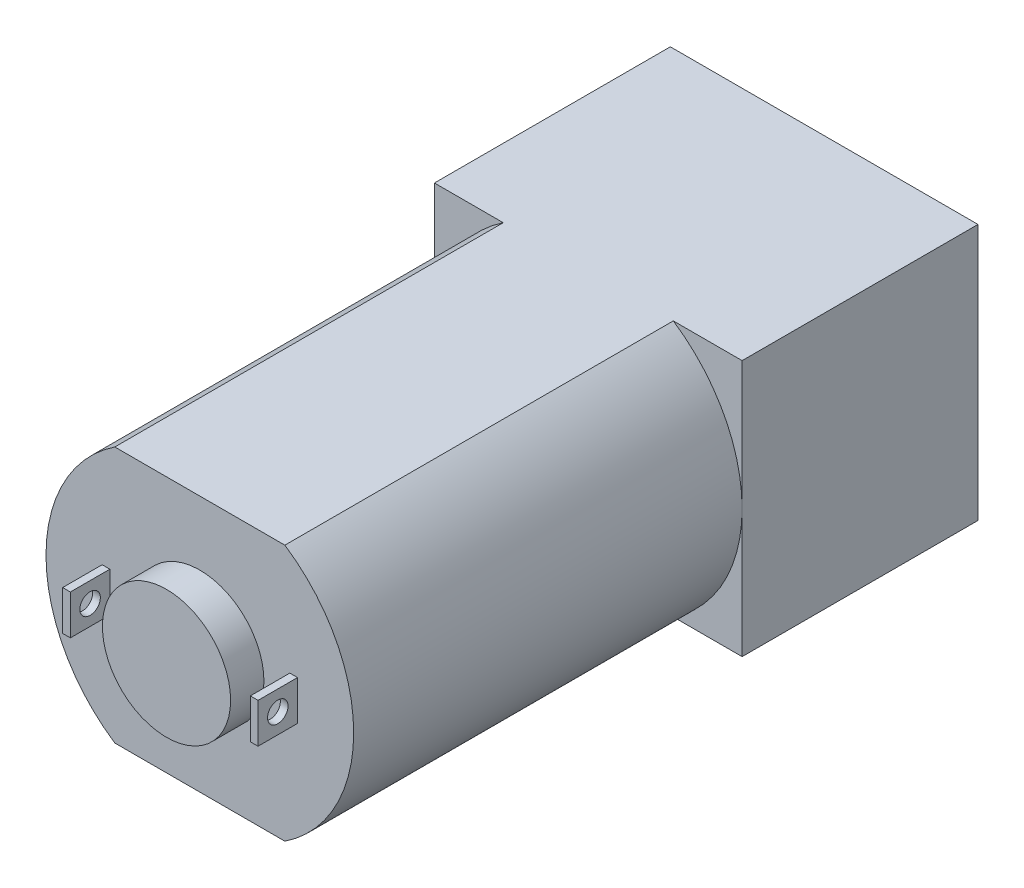
ISO-10303-21;
HEADER;
FILE_DESCRIPTION(('STEP AP214'),'2;1');
FILE_NAME('part.step','',(''),(''),'','','');
FILE_SCHEMA(('AUTOMOTIVE_DESIGN { 1 0 10303 214 1 1 1 1 }'));
ENDSEC;
DATA;
#1=APPLICATION_CONTEXT('core data for automotive mechanical design processes');
#2=APPLICATION_PROTOCOL_DEFINITION('international standard','automotive_design',2000,#1);
#3=PRODUCT_CONTEXT('',#1,'mechanical');
#4=PRODUCT('Part','Part','',(#3));
#5=PRODUCT_RELATED_PRODUCT_CATEGORY('part','',(#4));
#6=PRODUCT_DEFINITION_FORMATION('','',#4);
#7=PRODUCT_DEFINITION_CONTEXT('part definition',#1,'design');
#8=PRODUCT_DEFINITION('design','',#6,#7);
#9=PRODUCT_DEFINITION_SHAPE('','',#8);
#10=(LENGTH_UNIT() NAMED_UNIT(*) SI_UNIT(.MILLI.,.METRE.));
#11=(NAMED_UNIT(*) PLANE_ANGLE_UNIT() SI_UNIT($,.RADIAN.));
#12=(NAMED_UNIT(*) SI_UNIT($,.STERADIAN.) SOLID_ANGLE_UNIT());
#13=UNCERTAINTY_MEASURE_WITH_UNIT(LENGTH_MEASURE(1.E-05),#10,'distance_accuracy_value','');
#14=(GEOMETRIC_REPRESENTATION_CONTEXT(3) GLOBAL_UNCERTAINTY_ASSIGNED_CONTEXT((#13)) GLOBAL_UNIT_ASSIGNED_CONTEXT((#10,
#11,#12)) REPRESENTATION_CONTEXT('',''));
#15=CARTESIAN_POINT('',(0.,0.,0.));
#16=DIRECTION('',(0.,0.,1.));
#17=DIRECTION('',(1.,0.,0.));
#18=AXIS2_PLACEMENT_3D('',#15,#16,#17);
#19=CARTESIAN_POINT('',(3.81,0.775000000000002,16.69));
#20=DIRECTION('',(0.,-1.,0.));
#21=DIRECTION('',(1.,0.,0.));
#22=AXIS2_PLACEMENT_3D('',#19,#20,#21);
#23=PLANE('',#22);
#24=DIRECTION('',(-1.,0.,0.));
#25=VECTOR('',#24,1.);
#26=CARTESIAN_POINT('',(3.81,0.775000000000002,15.15));
#27=LINE('',#26,#25);
#28=CARTESIAN_POINT('',(3.81,0.775000000000002,15.15));
#29=VERTEX_POINT('',#28);
#30=CARTESIAN_POINT('',(3.51,0.775000000000002,15.15));
#31=VERTEX_POINT('',#30);
#32=EDGE_CURVE('E108',#29,#31,#27,.T.);
#33=ORIENTED_EDGE('',*,*,#32,.T.);
#34=DIRECTION('',(0.,0.,-1.));
#35=VECTOR('',#34,1.);
#36=CARTESIAN_POINT('',(3.51,0.775000000000002,16.69));
#37=LINE('',#36,#35);
#38=CARTESIAN_POINT('',(3.51,0.775000000000002,16.69));
#39=VERTEX_POINT('',#38);
#40=EDGE_CURVE('E12',#39,#31,#37,.T.);
#41=ORIENTED_EDGE('',*,*,#40,.F.);
#42=DIRECTION('',(-1.,0.,0.));
#43=VECTOR('',#42,1.);
#44=CARTESIAN_POINT('',(3.81,0.775000000000002,16.69));
#45=LINE('',#44,#43);
#46=CARTESIAN_POINT('',(3.81,0.775000000000002,16.69));
#47=VERTEX_POINT('',#46);
#48=EDGE_CURVE('E96',#47,#39,#45,.T.);
#49=ORIENTED_EDGE('',*,*,#48,.F.);
#50=DIRECTION('',(0.,0.,-1.));
#51=VECTOR('',#50,1.);
#52=CARTESIAN_POINT('',(3.81,0.775000000000002,16.69));
#53=LINE('',#52,#51);
#54=EDGE_CURVE('E104',#47,#29,#53,.T.);
#55=ORIENTED_EDGE('',*,*,#54,.T.);
#56=EDGE_LOOP('',(#33,#41,#49,#55));
#57=FACE_BOUND('',#56,.T.);
#58=ADVANCED_FACE('F45',(#57),#23,.F.);
#59=CARTESIAN_POINT('',(3.51,0.775000000000002,16.69));
#60=DIRECTION('',(1.,0.,0.));
#61=DIRECTION('',(0.,1.,0.));
#62=AXIS2_PLACEMENT_3D('',#59,#60,#61);
#63=PLANE('',#62);
#64=CARTESIAN_POINT('',(3.51,0.,15.92));
#65=DIRECTION('',(-1.,0.,0.));
#66=DIRECTION('',(0.,-1.,0.));
#67=AXIS2_PLACEMENT_3D('',#64,#65,#66);
#68=CIRCLE('',#67,0.400000000000001);
#69=CARTESIAN_POINT('',(3.51,-0.4,15.92));
#70=VERTEX_POINT('',#69);
#71=EDGE_CURVE('E124',#70,#70,#68,.T.);
#72=ORIENTED_EDGE('',*,*,#71,.F.);
#73=EDGE_LOOP('',(#72));
#74=FACE_BOUND('',#73,.T.);
#75=DIRECTION('',(0.,-1.,0.));
#76=VECTOR('',#75,1.);
#77=CARTESIAN_POINT('',(3.51,0.775000000000002,15.15));
#78=LINE('',#77,#76);
#79=CARTESIAN_POINT('',(3.51,-0.775,15.15));
#80=VERTEX_POINT('',#79);
#81=EDGE_CURVE('E100',#31,#80,#78,.T.);
#82=ORIENTED_EDGE('',*,*,#81,.T.);
#83=DIRECTION('',(0.,0.,-1.));
#84=VECTOR('',#83,1.);
#85=CARTESIAN_POINT('',(3.51,-0.775,16.69));
#86=LINE('',#85,#84);
#87=CARTESIAN_POINT('',(3.51,-0.775,16.69));
#88=VERTEX_POINT('',#87);
#89=EDGE_CURVE('E53',#88,#80,#86,.T.);
#90=ORIENTED_EDGE('',*,*,#89,.F.);
#91=DIRECTION('',(0.,-1.,0.));
#92=VECTOR('',#91,1.);
#93=CARTESIAN_POINT('',(3.51,0.775000000000002,16.69));
#94=LINE('',#93,#92);
#95=EDGE_CURVE('E91',#39,#88,#94,.T.);
#96=ORIENTED_EDGE('',*,*,#95,.F.);
#97=ORIENTED_EDGE('',*,*,#40,.T.);
#98=EDGE_LOOP('',(#82,#90,#96,#97));
#99=FACE_BOUND('',#98,.T.);
#100=ADVANCED_FACE('F99',(#74,#99),#63,.F.);
#101=CARTESIAN_POINT('',(3.81,-0.775000000000001,16.69));
#102=DIRECTION('',(0.,1.,0.));
#103=DIRECTION('',(-1.,0.,0.));
#104=AXIS2_PLACEMENT_3D('',#101,#102,#103);
#105=PLANE('',#104);
#106=DIRECTION('',(1.,0.,0.));
#107=VECTOR('',#106,1.);
#108=CARTESIAN_POINT('',(3.81,-0.775000000000001,15.15));
#109=LINE('',#108,#107);
#110=CARTESIAN_POINT('',(3.81,-0.775000000000001,15.15));
#111=VERTEX_POINT('',#110);
#112=EDGE_CURVE('E78',#80,#111,#109,.T.);
#113=ORIENTED_EDGE('',*,*,#112,.T.);
#114=DIRECTION('',(0.,0.,-1.));
#115=VECTOR('',#114,1.);
#116=CARTESIAN_POINT('',(3.81,-0.775000000000001,16.69));
#117=LINE('',#116,#115);
#118=CARTESIAN_POINT('',(3.81,-0.775000000000001,16.69));
#119=VERTEX_POINT('',#118);
#120=EDGE_CURVE('E101',#119,#111,#117,.T.);
#121=ORIENTED_EDGE('',*,*,#120,.F.);
#122=DIRECTION('',(1.,0.,0.));
#123=VECTOR('',#122,1.);
#124=CARTESIAN_POINT('',(3.81,-0.775000000000001,16.69));
#125=LINE('',#124,#123);
#126=EDGE_CURVE('E94',#88,#119,#125,.T.);
#127=ORIENTED_EDGE('',*,*,#126,.F.);
#128=ORIENTED_EDGE('',*,*,#89,.T.);
#129=EDGE_LOOP('',(#113,#121,#127,#128));
#130=FACE_BOUND('',#129,.T.);
#131=ADVANCED_FACE('F102',(#130),#105,.F.);
#132=CARTESIAN_POINT('',(3.81,0.775000000000002,16.69));
#133=DIRECTION('',(-1.,0.,0.));
#134=DIRECTION('',(0.,-1.,0.));
#135=AXIS2_PLACEMENT_3D('',#132,#133,#134);
#136=PLANE('',#135);
#137=CARTESIAN_POINT('',(3.81,0.,15.92));
#138=DIRECTION('',(-1.,0.,0.));
#139=DIRECTION('',(0.,-1.,0.));
#140=AXIS2_PLACEMENT_3D('',#137,#138,#139);
#141=CIRCLE('',#140,0.400000000000001);
#142=CARTESIAN_POINT('',(3.81,-0.4,15.92));
#143=VERTEX_POINT('',#142);
#144=EDGE_CURVE('E111',#143,#143,#141,.F.);
#145=ORIENTED_EDGE('',*,*,#144,.F.);
#146=EDGE_LOOP('',(#145));
#147=FACE_BOUND('',#146,.T.);
#148=DIRECTION('',(0.,1.,0.));
#149=VECTOR('',#148,1.);
#150=CARTESIAN_POINT('',(3.81,0.775000000000002,15.15));
#151=LINE('',#150,#149);
#152=EDGE_CURVE('E84',#111,#29,#151,.T.);
#153=ORIENTED_EDGE('',*,*,#152,.T.);
#154=ORIENTED_EDGE('',*,*,#54,.F.);
#155=DIRECTION('',(0.,1.,0.));
#156=VECTOR('',#155,1.);
#157=CARTESIAN_POINT('',(3.81,0.775000000000002,16.69));
#158=LINE('',#157,#156);
#159=EDGE_CURVE('E61',#119,#47,#158,.T.);
#160=ORIENTED_EDGE('',*,*,#159,.F.);
#161=ORIENTED_EDGE('',*,*,#120,.T.);
#162=EDGE_LOOP('',(#153,#154,#160,#161));
#163=FACE_BOUND('',#162,.T.);
#164=ADVANCED_FACE('F116',(#147,#163),#136,.F.);
#165=CARTESIAN_POINT('',(0.,0.,16.69));
#166=DIRECTION('',(0.,0.,1.));
#167=DIRECTION('',(1.,0.,0.));
#168=AXIS2_PLACEMENT_3D('',#165,#166,#167);
#169=PLANE('',#168);
#170=ORIENTED_EDGE('',*,*,#48,.T.);
#171=ORIENTED_EDGE('',*,*,#95,.T.);
#172=ORIENTED_EDGE('',*,*,#126,.T.);
#173=ORIENTED_EDGE('',*,*,#159,.T.);
#174=EDGE_LOOP('',(#170,#171,#172,#173));
#175=FACE_BOUND('',#174,.T.);
#176=ADVANCED_FACE('F92',(#175),#169,.T.);
#177=CARTESIAN_POINT('',(0.,0.,15.15));
#178=DIRECTION('',(0.,0.,1.));
#179=DIRECTION('',(1.,0.,0.));
#180=AXIS2_PLACEMENT_3D('',#177,#178,#179);
#181=PLANE('',#180);
#182=ORIENTED_EDGE('',*,*,#32,.F.);
#183=ORIENTED_EDGE('',*,*,#152,.F.);
#184=ORIENTED_EDGE('',*,*,#112,.F.);
#185=ORIENTED_EDGE('',*,*,#81,.F.);
#186=EDGE_LOOP('',(#182,#183,#184,#185));
#187=FACE_BOUND('',#186,.T.);
#188=ADVANCED_FACE('F119',(#187),#181,.F.);
#189=CARTESIAN_POINT('',(6.00102500000001,0.,15.92));
#190=DIRECTION('',(-1.,0.,0.));
#191=DIRECTION('',(0.,-1.,0.));
#192=AXIS2_PLACEMENT_3D('',#189,#190,#191);
#193=CYLINDRICAL_SURFACE('',#192,0.400000000000001);
#194=ORIENTED_EDGE('',*,*,#71,.T.);
#195=EDGE_LOOP('',(#194));
#196=FACE_BOUND('',#195,.T.);
#197=ORIENTED_EDGE('',*,*,#144,.T.);
#198=EDGE_LOOP('',(#197));
#199=FACE_BOUND('',#198,.T.);
#200=ADVANCED_FACE('F128',(#196,#199),#193,.F.);
#201=CLOSED_SHELL('',(#58,#100,#131,#164,#176,#188,#200));
#202=MANIFOLD_SOLID_BREP('B2',#201);
#203=CARTESIAN_POINT('',(-3.81,0.774999999999999,16.69));
#204=DIRECTION('',(1.,0.,0.));
#205=DIRECTION('',(0.,1.,0.));
#206=AXIS2_PLACEMENT_3D('',#203,#204,#205);
#207=PLANE('',#206);
#208=CARTESIAN_POINT('',(-3.81,0.,15.92));
#209=DIRECTION('',(-1.,0.,0.));
#210=DIRECTION('',(0.,-1.,0.));
#211=AXIS2_PLACEMENT_3D('',#208,#209,#210);
#212=CIRCLE('',#211,0.400000000000001);
#213=CARTESIAN_POINT('',(-3.81,-0.400000000000002,15.92));
#214=VERTEX_POINT('',#213);
#215=EDGE_CURVE('E287',#214,#214,#212,.T.);
#216=ORIENTED_EDGE('',*,*,#215,.F.);
#217=EDGE_LOOP('',(#216));
#218=FACE_BOUND('',#217,.T.);
#219=DIRECTION('',(0.,-1.,0.));
#220=VECTOR('',#219,1.);
#221=CARTESIAN_POINT('',(-3.81,0.774999999999999,15.15));
#222=LINE('',#221,#220);
#223=CARTESIAN_POINT('',(-3.81,0.774999999999999,15.15));
#224=VERTEX_POINT('',#223);
#225=CARTESIAN_POINT('',(-3.81,-0.775000000000001,15.15));
#226=VERTEX_POINT('',#225);
#227=EDGE_CURVE('E271',#224,#226,#222,.T.);
#228=ORIENTED_EDGE('',*,*,#227,.T.);
#229=DIRECTION('',(0.,0.,-1.));
#230=VECTOR('',#229,1.);
#231=CARTESIAN_POINT('',(-3.81,-0.775000000000001,16.69));
#232=LINE('',#231,#230);
#233=CARTESIAN_POINT('',(-3.81,-0.775000000000001,16.69));
#234=VERTEX_POINT('',#233);
#235=EDGE_CURVE('E43',#234,#226,#232,.T.);
#236=ORIENTED_EDGE('',*,*,#235,.F.);
#237=DIRECTION('',(0.,-1.,0.));
#238=VECTOR('',#237,1.);
#239=CARTESIAN_POINT('',(-3.81,0.774999999999999,16.69));
#240=LINE('',#239,#238);
#241=CARTESIAN_POINT('',(-3.81,0.774999999999999,16.69));
#242=VERTEX_POINT('',#241);
#243=EDGE_CURVE('E259',#242,#234,#240,.T.);
#244=ORIENTED_EDGE('',*,*,#243,.F.);
#245=DIRECTION('',(0.,0.,-1.));
#246=VECTOR('',#245,1.);
#247=CARTESIAN_POINT('',(-3.81,0.774999999999999,16.69));
#248=LINE('',#247,#246);
#249=EDGE_CURVE('E267',#242,#224,#248,.T.);
#250=ORIENTED_EDGE('',*,*,#249,.T.);
#251=EDGE_LOOP('',(#228,#236,#244,#250));
#252=FACE_BOUND('',#251,.T.);
#253=ADVANCED_FACE('F208',(#218,#252),#207,.F.);
#254=CARTESIAN_POINT('',(-3.81,-0.775000000000001,16.69));
#255=DIRECTION('',(0.,1.,0.));
#256=DIRECTION('',(-1.,0.,0.));
#257=AXIS2_PLACEMENT_3D('',#254,#255,#256);
#258=PLANE('',#257);
#259=DIRECTION('',(1.,0.,0.));
#260=VECTOR('',#259,1.);
#261=CARTESIAN_POINT('',(-3.81,-0.775000000000001,15.15));
#262=LINE('',#261,#260);
#263=CARTESIAN_POINT('',(-3.51,-0.775,15.15));
#264=VERTEX_POINT('',#263);
#265=EDGE_CURVE('E263',#226,#264,#262,.T.);
#266=ORIENTED_EDGE('',*,*,#265,.T.);
#267=DIRECTION('',(0.,0.,-1.));
#268=VECTOR('',#267,1.);
#269=CARTESIAN_POINT('',(-3.51,-0.775,16.69));
#270=LINE('',#269,#268);
#271=CARTESIAN_POINT('',(-3.51,-0.775,16.69));
#272=VERTEX_POINT('',#271);
#273=EDGE_CURVE('E216',#272,#264,#270,.T.);
#274=ORIENTED_EDGE('',*,*,#273,.F.);
#275=DIRECTION('',(1.,0.,0.));
#276=VECTOR('',#275,1.);
#277=CARTESIAN_POINT('',(-3.81,-0.775000000000001,16.69));
#278=LINE('',#277,#276);
#279=EDGE_CURVE('E254',#234,#272,#278,.T.);
#280=ORIENTED_EDGE('',*,*,#279,.F.);
#281=ORIENTED_EDGE('',*,*,#235,.T.);
#282=EDGE_LOOP('',(#266,#274,#280,#281));
#283=FACE_BOUND('',#282,.T.);
#284=ADVANCED_FACE('F262',(#283),#258,.F.);
#285=CARTESIAN_POINT('',(-3.51,0.774999999999999,16.69));
#286=DIRECTION('',(-1.,0.,0.));
#287=DIRECTION('',(0.,-1.,0.));
#288=AXIS2_PLACEMENT_3D('',#285,#286,#287);
#289=PLANE('',#288);
#290=CARTESIAN_POINT('',(-3.51,0.,15.92));
#291=DIRECTION('',(-1.,0.,0.));
#292=DIRECTION('',(0.,-1.,0.));
#293=AXIS2_PLACEMENT_3D('',#290,#291,#292);
#294=CIRCLE('',#293,0.400000000000001);
#295=CARTESIAN_POINT('',(-3.51,-0.400000000000002,15.92));
#296=VERTEX_POINT('',#295);
#297=EDGE_CURVE('E274',#296,#296,#294,.F.);
#298=ORIENTED_EDGE('',*,*,#297,.F.);
#299=EDGE_LOOP('',(#298));
#300=FACE_BOUND('',#299,.T.);
#301=DIRECTION('',(0.,1.,0.));
#302=VECTOR('',#301,1.);
#303=CARTESIAN_POINT('',(-3.51,0.774999999999999,15.15));
#304=LINE('',#303,#302);
#305=CARTESIAN_POINT('',(-3.51,0.774999999999999,15.15));
#306=VERTEX_POINT('',#305);
#307=EDGE_CURVE('E241',#264,#306,#304,.T.);
#308=ORIENTED_EDGE('',*,*,#307,.T.);
#309=DIRECTION('',(0.,0.,-1.));
#310=VECTOR('',#309,1.);
#311=CARTESIAN_POINT('',(-3.51,0.774999999999999,16.69));
#312=LINE('',#311,#310);
#313=CARTESIAN_POINT('',(-3.51,0.774999999999999,16.69));
#314=VERTEX_POINT('',#313);
#315=EDGE_CURVE('E264',#314,#306,#312,.T.);
#316=ORIENTED_EDGE('',*,*,#315,.F.);
#317=DIRECTION('',(0.,1.,0.));
#318=VECTOR('',#317,1.);
#319=CARTESIAN_POINT('',(-3.51,0.774999999999999,16.69));
#320=LINE('',#319,#318);
#321=EDGE_CURVE('E257',#272,#314,#320,.T.);
#322=ORIENTED_EDGE('',*,*,#321,.F.);
#323=ORIENTED_EDGE('',*,*,#273,.T.);
#324=EDGE_LOOP('',(#308,#316,#322,#323));
#325=FACE_BOUND('',#324,.T.);
#326=ADVANCED_FACE('F265',(#300,#325),#289,.F.);
#327=CARTESIAN_POINT('',(-3.81,0.774999999999999,16.69));
#328=DIRECTION('',(0.,-1.,0.));
#329=DIRECTION('',(1.,0.,0.));
#330=AXIS2_PLACEMENT_3D('',#327,#328,#329);
#331=PLANE('',#330);
#332=DIRECTION('',(-1.,0.,0.));
#333=VECTOR('',#332,1.);
#334=CARTESIAN_POINT('',(-3.81,0.774999999999999,15.15));
#335=LINE('',#334,#333);
#336=EDGE_CURVE('E247',#306,#224,#335,.T.);
#337=ORIENTED_EDGE('',*,*,#336,.T.);
#338=ORIENTED_EDGE('',*,*,#249,.F.);
#339=DIRECTION('',(-1.,0.,0.));
#340=VECTOR('',#339,1.);
#341=CARTESIAN_POINT('',(-3.81,0.774999999999999,16.69));
#342=LINE('',#341,#340);
#343=EDGE_CURVE('E224',#314,#242,#342,.T.);
#344=ORIENTED_EDGE('',*,*,#343,.F.);
#345=ORIENTED_EDGE('',*,*,#315,.T.);
#346=EDGE_LOOP('',(#337,#338,#344,#345));
#347=FACE_BOUND('',#346,.T.);
#348=ADVANCED_FACE('F279',(#347),#331,.F.);
#349=CARTESIAN_POINT('',(0.,0.,16.69));
#350=DIRECTION('',(0.,0.,1.));
#351=DIRECTION('',(1.,0.,0.));
#352=AXIS2_PLACEMENT_3D('',#349,#350,#351);
#353=PLANE('',#352);
#354=ORIENTED_EDGE('',*,*,#243,.T.);
#355=ORIENTED_EDGE('',*,*,#279,.T.);
#356=ORIENTED_EDGE('',*,*,#321,.T.);
#357=ORIENTED_EDGE('',*,*,#343,.T.);
#358=EDGE_LOOP('',(#354,#355,#356,#357));
#359=FACE_BOUND('',#358,.T.);
#360=ADVANCED_FACE('F255',(#359),#353,.T.);
#361=CARTESIAN_POINT('',(0.,0.,15.15));
#362=DIRECTION('',(0.,0.,1.));
#363=DIRECTION('',(1.,0.,0.));
#364=AXIS2_PLACEMENT_3D('',#361,#362,#363);
#365=PLANE('',#364);
#366=ORIENTED_EDGE('',*,*,#227,.F.);
#367=ORIENTED_EDGE('',*,*,#336,.F.);
#368=ORIENTED_EDGE('',*,*,#307,.F.);
#369=ORIENTED_EDGE('',*,*,#265,.F.);
#370=EDGE_LOOP('',(#366,#367,#368,#369));
#371=FACE_BOUND('',#370,.T.);
#372=ADVANCED_FACE('F282',(#371),#365,.F.);
#373=CARTESIAN_POINT('',(6.00102500000001,0.,15.92));
#374=DIRECTION('',(-1.,0.,0.));
#375=DIRECTION('',(0.,-1.,0.));
#376=AXIS2_PLACEMENT_3D('',#373,#374,#375);
#377=CYLINDRICAL_SURFACE('',#376,0.400000000000001);
#378=ORIENTED_EDGE('',*,*,#215,.T.);
#379=EDGE_LOOP('',(#378));
#380=FACE_BOUND('',#379,.T.);
#381=ORIENTED_EDGE('',*,*,#297,.T.);
#382=EDGE_LOOP('',(#381));
#383=FACE_BOUND('',#382,.T.);
#384=ADVANCED_FACE('F291',(#380,#383),#377,.F.);
#385=CLOSED_SHELL('',(#253,#284,#326,#348,#360,#372,#384));
#386=MANIFOLD_SOLID_BREP('B6',#385);
#387=CARTESIAN_POINT('',(0.,0.,-9.2));
#388=DIRECTION('',(0.,0.,-1.));
#389=DIRECTION('',(-1.,0.,0.));
#390=AXIS2_PLACEMENT_3D('',#387,#388,#389);
#391=PLANE('',#390);
#392=DIRECTION('',(0.,-1.,0.));
#393=VECTOR('',#392,1.);
#394=CARTESIAN_POINT('',(6.,5.,-9.2));
#395=LINE('',#394,#393);
#396=CARTESIAN_POINT('',(6.,5.,-9.2));
#397=VERTEX_POINT('',#396);
#398=CARTESIAN_POINT('',(6.,-4.99999999999999,-9.2));
#399=VERTEX_POINT('',#398);
#400=EDGE_CURVE('E443',#397,#399,#395,.T.);
#401=ORIENTED_EDGE('',*,*,#400,.T.);
#402=DIRECTION('',(-1.,0.,0.));
#403=VECTOR('',#402,1.);
#404=CARTESIAN_POINT('',(6.,-4.99999999999999,-9.2));
#405=LINE('',#404,#403);
#406=CARTESIAN_POINT('',(-6.,-4.99999999999999,-9.2));
#407=VERTEX_POINT('',#406);
#408=EDGE_CURVE('E431',#399,#407,#405,.T.);
#409=ORIENTED_EDGE('',*,*,#408,.T.);
#410=DIRECTION('',(0.,1.,0.));
#411=VECTOR('',#410,1.);
#412=CARTESIAN_POINT('',(-6.,5.,-9.2));
#413=LINE('',#412,#411);
#414=CARTESIAN_POINT('',(-6.,5.,-9.2));
#415=VERTEX_POINT('',#414);
#416=EDGE_CURVE('E442',#407,#415,#413,.T.);
#417=ORIENTED_EDGE('',*,*,#416,.T.);
#418=DIRECTION('',(1.,0.,0.));
#419=VECTOR('',#418,1.);
#420=CARTESIAN_POINT('',(6.,5.,-9.2));
#421=LINE('',#420,#419);
#422=EDGE_CURVE('E448',#415,#397,#421,.T.);
#423=ORIENTED_EDGE('',*,*,#422,.T.);
#424=EDGE_LOOP('',(#401,#409,#417,#423));
#425=FACE_BOUND('',#424,.T.);
#426=CARTESIAN_POINT('',(0.,0.,-9.2));
#427=DIRECTION('',(0.,0.,-1.));
#428=DIRECTION('',(-1.,0.,0.));
#429=AXIS2_PLACEMENT_3D('',#426,#427,#428);
#430=CIRCLE('',#429,2.);
#431=CARTESIAN_POINT('',(-2.,0.,-9.2));
#432=VERTEX_POINT('',#431);
#433=EDGE_CURVE('E546',#432,#432,#430,.T.);
#434=ORIENTED_EDGE('',*,*,#433,.F.);
#435=EDGE_LOOP('',(#434));
#436=FACE_BOUND('',#435,.T.);
#437=ADVANCED_FACE('F362',(#425,#436),#391,.T.);
#438=CARTESIAN_POINT('',(0.,0.,15.15));
#439=DIRECTION('',(0.,0.,1.));
#440=DIRECTION('',(1.,0.,0.));
#441=AXIS2_PLACEMENT_3D('',#438,#439,#440);
#442=PLANE('',#441);
#443=CARTESIAN_POINT('',(0.,0.,15.15));
#444=DIRECTION('',(0.,0.,1.));
#445=DIRECTION('',(1.,0.,0.));
#446=AXIS2_PLACEMENT_3D('',#443,#444,#445);
#447=CIRCLE('',#446,6.);
#448=CARTESIAN_POINT('',(3.31662479035541,-4.99999999999999,15.15));
#449=VERTEX_POINT('',#448);
#450=CARTESIAN_POINT('',(3.31662479035541,5.,15.15));
#451=VERTEX_POINT('',#450);
#452=EDGE_CURVE('E497',#449,#451,#447,.T.);
#453=ORIENTED_EDGE('',*,*,#452,.T.);
#454=DIRECTION('',(-1.,0.,0.));
#455=VECTOR('',#454,1.);
#456=CARTESIAN_POINT('',(3.31662479035541,5.,15.15));
#457=LINE('',#456,#455);
#458=CARTESIAN_POINT('',(-3.3166247903554,5.,15.15));
#459=VERTEX_POINT('',#458);
#460=EDGE_CURVE('E500',#451,#459,#457,.T.);
#461=ORIENTED_EDGE('',*,*,#460,.T.);
#462=CARTESIAN_POINT('',(0.,0.,15.15));
#463=DIRECTION('',(0.,0.,1.));
#464=DIRECTION('',(1.,0.,0.));
#465=AXIS2_PLACEMENT_3D('',#462,#463,#464);
#466=CIRCLE('',#465,6.);
#467=CARTESIAN_POINT('',(-3.31662479035541,-4.99999999999999,15.15));
#468=VERTEX_POINT('',#467);
#469=EDGE_CURVE('E521',#459,#468,#466,.T.);
#470=ORIENTED_EDGE('',*,*,#469,.T.);
#471=DIRECTION('',(1.,0.,0.));
#472=VECTOR('',#471,1.);
#473=CARTESIAN_POINT('',(3.31662479035541,-4.99999999999999,15.15));
#474=LINE('',#473,#472);
#475=EDGE_CURVE('E380',#468,#449,#474,.T.);
#476=ORIENTED_EDGE('',*,*,#475,.T.);
#477=EDGE_LOOP('',(#453,#461,#470,#476));
#478=FACE_BOUND('',#477,.T.);
#479=CARTESIAN_POINT('',(0.,0.,15.15));
#480=DIRECTION('',(0.,0.,1.));
#481=DIRECTION('',(1.,0.,0.));
#482=AXIS2_PLACEMENT_3D('',#479,#480,#481);
#483=CIRCLE('',#482,2.5);
#484=CARTESIAN_POINT('',(2.5,0.,15.15));
#485=VERTEX_POINT('',#484);
#486=EDGE_CURVE('E539',#485,#485,#483,.T.);
#487=ORIENTED_EDGE('',*,*,#486,.F.);
#488=EDGE_LOOP('',(#487));
#489=FACE_BOUND('',#488,.T.);
#490=ADVANCED_FACE('F561',(#478,#489),#442,.T.);
#491=CARTESIAN_POINT('',(0.,0.,15.15));
#492=DIRECTION('',(0.,0.,-1.));
#493=DIRECTION('',(-1.,0.,0.));
#494=AXIS2_PLACEMENT_3D('',#491,#492,#493);
#495=CYLINDRICAL_SURFACE('',#494,6.);
#496=CARTESIAN_POINT('',(0.,0.,0.));
#497=DIRECTION('',(0.,0.,1.));
#498=DIRECTION('',(1.,0.,0.));
#499=AXIS2_PLACEMENT_3D('',#496,#497,#498);
#500=CIRCLE('',#499,6.);
#501=CARTESIAN_POINT('',(3.31662479035541,-4.99999999999999,0.));
#502=VERTEX_POINT('',#501);
#503=CARTESIAN_POINT('',(6.,0.,0.));
#504=VERTEX_POINT('',#503);
#505=EDGE_CURVE('E462',#502,#504,#500,.T.);
#506=ORIENTED_EDGE('',*,*,#505,.T.);
#507=CARTESIAN_POINT('',(3.3166247903554,5.,0.));
#508=VERTEX_POINT('',#507);
#509=EDGE_CURVE('E459',#504,#508,#500,.T.);
#510=ORIENTED_EDGE('',*,*,#509,.T.);
#511=DIRECTION('',(0.,0.,-1.));
#512=VECTOR('',#511,1.);
#513=CARTESIAN_POINT('',(3.31662479035541,5.,15.15));
#514=LINE('',#513,#512);
#515=EDGE_CURVE('E206',#451,#508,#514,.T.);
#516=ORIENTED_EDGE('',*,*,#515,.F.);
#517=ORIENTED_EDGE('',*,*,#452,.F.);
#518=DIRECTION('',(0.,0.,-1.));
#519=VECTOR('',#518,1.);
#520=CARTESIAN_POINT('',(3.31662479035541,-4.99999999999999,15.15));
#521=LINE('',#520,#519);
#522=EDGE_CURVE('E515',#449,#502,#521,.T.);
#523=ORIENTED_EDGE('',*,*,#522,.T.);
#524=EDGE_LOOP('',(#506,#510,#516,#517,#523));
#525=FACE_BOUND('',#524,.T.);
#526=ADVANCED_FACE('F364',(#525),#495,.T.);
#527=CARTESIAN_POINT('',(3.31662479035541,5.,15.15));
#528=DIRECTION('',(0.,-1.,0.));
#529=DIRECTION('',(0.,0.,-1.));
#530=AXIS2_PLACEMENT_3D('',#527,#528,#529);
#531=PLANE('',#530);
#532=ORIENTED_EDGE('',*,*,#515,.T.);
#533=DIRECTION('',(1.,0.,0.));
#534=VECTOR('',#533,1.);
#535=CARTESIAN_POINT('',(6.,5.,0.));
#536=LINE('',#535,#534);
#537=CARTESIAN_POINT('',(6.,5.,0.));
#538=VERTEX_POINT('',#537);
#539=EDGE_CURVE('E471',#508,#538,#536,.T.);
#540=ORIENTED_EDGE('',*,*,#539,.T.);
#541=DIRECTION('',(0.,0.,1.));
#542=VECTOR('',#541,1.);
#543=CARTESIAN_POINT('',(6.,5.,-9.2));
#544=LINE('',#543,#542);
#545=EDGE_CURVE('E478',#397,#538,#544,.T.);
#546=ORIENTED_EDGE('',*,*,#545,.F.);
#547=ORIENTED_EDGE('',*,*,#422,.F.);
#548=DIRECTION('',(0.,0.,1.));
#549=VECTOR('',#548,1.);
#550=CARTESIAN_POINT('',(-6.,5.,-9.2));
#551=LINE('',#550,#549);
#552=CARTESIAN_POINT('',(-6.,5.,0.));
#553=VERTEX_POINT('',#552);
#554=EDGE_CURVE('E464',#415,#553,#551,.T.);
#555=ORIENTED_EDGE('',*,*,#554,.T.);
#556=CARTESIAN_POINT('',(-3.3166247903554,5.,0.));
#557=VERTEX_POINT('',#556);
#558=EDGE_CURVE('E452',#553,#557,#536,.T.);
#559=ORIENTED_EDGE('',*,*,#558,.T.);
#560=DIRECTION('',(0.,0.,-1.));
#561=VECTOR('',#560,1.);
#562=CARTESIAN_POINT('',(-3.3166247903554,5.,15.15));
#563=LINE('',#562,#561);
#564=EDGE_CURVE('E372',#459,#557,#563,.T.);
#565=ORIENTED_EDGE('',*,*,#564,.F.);
#566=ORIENTED_EDGE('',*,*,#460,.F.);
#567=EDGE_LOOP('',(#532,#540,#546,#547,#555,#559,#565,#566));
#568=FACE_BOUND('',#567,.T.);
#569=ADVANCED_FACE('F484',(#568),#531,.F.);
#570=CARTESIAN_POINT('',(0.,0.,15.15));
#571=DIRECTION('',(0.,0.,-1.));
#572=DIRECTION('',(-1.,0.,0.));
#573=AXIS2_PLACEMENT_3D('',#570,#571,#572);
#574=CYLINDRICAL_SURFACE('',#573,6.);
#575=CARTESIAN_POINT('',(0.,0.,0.));
#576=DIRECTION('',(0.,0.,1.));
#577=DIRECTION('',(1.,0.,0.));
#578=AXIS2_PLACEMENT_3D('',#575,#576,#577);
#579=CIRCLE('',#578,6.);
#580=CARTESIAN_POINT('',(-6.,0.,0.));
#581=VERTEX_POINT('',#580);
#582=EDGE_CURVE('E494',#557,#581,#579,.T.);
#583=ORIENTED_EDGE('',*,*,#582,.T.);
#584=CARTESIAN_POINT('',(-3.31662479035541,-4.99999999999999,0.));
#585=VERTEX_POINT('',#584);
#586=EDGE_CURVE('E498',#581,#585,#579,.T.);
#587=ORIENTED_EDGE('',*,*,#586,.T.);
#588=DIRECTION('',(0.,0.,-1.));
#589=VECTOR('',#588,1.);
#590=CARTESIAN_POINT('',(-3.31662479035541,-4.99999999999999,15.15));
#591=LINE('',#590,#589);
#592=EDGE_CURVE('E514',#468,#585,#591,.T.);
#593=ORIENTED_EDGE('',*,*,#592,.F.);
#594=ORIENTED_EDGE('',*,*,#469,.F.);
#595=ORIENTED_EDGE('',*,*,#564,.T.);
#596=EDGE_LOOP('',(#583,#587,#593,#594,#595));
#597=FACE_BOUND('',#596,.T.);
#598=ADVANCED_FACE('F582',(#597),#574,.T.);
#599=CARTESIAN_POINT('',(3.31662479035541,-4.99999999999999,15.15));
#600=DIRECTION('',(0.,1.,0.));
#601=DIRECTION('',(0.,0.,1.));
#602=AXIS2_PLACEMENT_3D('',#599,#600,#601);
#603=PLANE('',#602);
#604=ORIENTED_EDGE('',*,*,#592,.T.);
#605=DIRECTION('',(-1.,0.,0.));
#606=VECTOR('',#605,1.);
#607=CARTESIAN_POINT('',(6.,-4.99999999999999,0.));
#608=LINE('',#607,#606);
#609=CARTESIAN_POINT('',(-6.,-4.99999999999999,0.));
#610=VERTEX_POINT('',#609);
#611=EDGE_CURVE('E530',#585,#610,#608,.T.);
#612=ORIENTED_EDGE('',*,*,#611,.T.);
#613=DIRECTION('',(0.,0.,1.));
#614=VECTOR('',#613,1.);
#615=CARTESIAN_POINT('',(-6.,-4.99999999999999,-9.2));
#616=LINE('',#615,#614);
#617=EDGE_CURVE('E439',#407,#610,#616,.T.);
#618=ORIENTED_EDGE('',*,*,#617,.F.);
#619=ORIENTED_EDGE('',*,*,#408,.F.);
#620=DIRECTION('',(0.,0.,1.));
#621=VECTOR('',#620,1.);
#622=CARTESIAN_POINT('',(6.,-4.99999999999999,-9.2));
#623=LINE('',#622,#621);
#624=CARTESIAN_POINT('',(6.,-4.99999999999999,0.));
#625=VERTEX_POINT('',#624);
#626=EDGE_CURVE('E437',#399,#625,#623,.T.);
#627=ORIENTED_EDGE('',*,*,#626,.T.);
#628=EDGE_CURVE('E529',#625,#502,#608,.T.);
#629=ORIENTED_EDGE('',*,*,#628,.T.);
#630=ORIENTED_EDGE('',*,*,#522,.F.);
#631=ORIENTED_EDGE('',*,*,#475,.F.);
#632=EDGE_LOOP('',(#604,#612,#618,#619,#627,#629,#630,#631));
#633=FACE_BOUND('',#632,.T.);
#634=ADVANCED_FACE('F434',(#633),#603,.F.);
#635=CARTESIAN_POINT('',(0.,0.,0.));
#636=DIRECTION('',(0.,0.,-1.));
#637=DIRECTION('',(-1.,0.,0.));
#638=AXIS2_PLACEMENT_3D('',#635,#636,#637);
#639=PLANE('',#638);
#640=ORIENTED_EDGE('',*,*,#505,.F.);
#641=ORIENTED_EDGE('',*,*,#628,.F.);
#642=DIRECTION('',(0.,-1.,0.));
#643=VECTOR('',#642,1.);
#644=CARTESIAN_POINT('',(6.,5.,0.));
#645=LINE('',#644,#643);
#646=EDGE_CURVE('E457',#504,#625,#645,.T.);
#647=ORIENTED_EDGE('',*,*,#646,.F.);
#648=EDGE_LOOP('',(#640,#641,#647));
#649=FACE_BOUND('',#648,.T.);
#650=ADVANCED_FACE('F528',(#649),#639,.F.);
#651=ORIENTED_EDGE('',*,*,#509,.F.);
#652=EDGE_CURVE('E531',#538,#504,#645,.T.);
#653=ORIENTED_EDGE('',*,*,#652,.F.);
#654=ORIENTED_EDGE('',*,*,#539,.F.);
#655=EDGE_LOOP('',(#651,#653,#654));
#656=FACE_BOUND('',#655,.T.);
#657=ADVANCED_FACE('F652',(#656),#639,.F.);
#658=ORIENTED_EDGE('',*,*,#582,.F.);
#659=ORIENTED_EDGE('',*,*,#558,.F.);
#660=DIRECTION('',(0.,1.,0.));
#661=VECTOR('',#660,1.);
#662=CARTESIAN_POINT('',(-6.,5.,0.));
#663=LINE('',#662,#661);
#664=EDGE_CURVE('E491',#581,#553,#663,.T.);
#665=ORIENTED_EDGE('',*,*,#664,.F.);
#666=EDGE_LOOP('',(#658,#659,#665));
#667=FACE_BOUND('',#666,.T.);
#668=ADVANCED_FACE('F490',(#667),#639,.F.);
#669=CARTESIAN_POINT('',(6.,5.,-9.2));
#670=DIRECTION('',(-1.,0.,0.));
#671=DIRECTION('',(0.,-1.,0.));
#672=AXIS2_PLACEMENT_3D('',#669,#670,#671);
#673=PLANE('',#672);
#674=ORIENTED_EDGE('',*,*,#652,.T.);
#675=ORIENTED_EDGE('',*,*,#646,.T.);
#676=ORIENTED_EDGE('',*,*,#626,.F.);
#677=ORIENTED_EDGE('',*,*,#400,.F.);
#678=ORIENTED_EDGE('',*,*,#545,.T.);
#679=EDGE_LOOP('',(#674,#675,#676,#677,#678));
#680=FACE_BOUND('',#679,.T.);
#681=ADVANCED_FACE('F455',(#680),#673,.F.);
#682=CARTESIAN_POINT('',(-6.,5.,-9.2));
#683=DIRECTION('',(1.,0.,0.));
#684=DIRECTION('',(0.,1.,0.));
#685=AXIS2_PLACEMENT_3D('',#682,#683,#684);
#686=PLANE('',#685);
#687=EDGE_CURVE('E476',#610,#581,#663,.T.);
#688=ORIENTED_EDGE('',*,*,#687,.T.);
#689=ORIENTED_EDGE('',*,*,#664,.T.);
#690=ORIENTED_EDGE('',*,*,#554,.F.);
#691=ORIENTED_EDGE('',*,*,#416,.F.);
#692=ORIENTED_EDGE('',*,*,#617,.T.);
#693=EDGE_LOOP('',(#688,#689,#690,#691,#692));
#694=FACE_BOUND('',#693,.T.);
#695=ADVANCED_FACE('F574',(#694),#686,.F.);
#696=ORIENTED_EDGE('',*,*,#586,.F.);
#697=ORIENTED_EDGE('',*,*,#687,.F.);
#698=ORIENTED_EDGE('',*,*,#611,.F.);
#699=EDGE_LOOP('',(#696,#697,#698));
#700=FACE_BOUND('',#699,.T.);
#701=ADVANCED_FACE('F571',(#700),#639,.F.);
#702=CARTESIAN_POINT('',(0.,0.,16.45));
#703=DIRECTION('',(0.,0.,-1.));
#704=DIRECTION('',(-1.,0.,0.));
#705=AXIS2_PLACEMENT_3D('',#702,#703,#704);
#706=CYLINDRICAL_SURFACE('',#705,2.5);
#707=CARTESIAN_POINT('',(0.,0.,16.45));
#708=DIRECTION('',(0.,0.,1.));
#709=DIRECTION('',(1.,0.,0.));
#710=AXIS2_PLACEMENT_3D('',#707,#708,#709);
#711=CIRCLE('',#710,2.5);
#712=CARTESIAN_POINT('',(2.5,0.,16.45));
#713=VERTEX_POINT('',#712);
#714=EDGE_CURVE('E542',#713,#713,#711,.T.);
#715=ORIENTED_EDGE('',*,*,#714,.F.);
#716=EDGE_LOOP('',(#715));
#717=FACE_BOUND('',#716,.T.);
#718=ORIENTED_EDGE('',*,*,#486,.T.);
#719=EDGE_LOOP('',(#718));
#720=FACE_BOUND('',#719,.T.);
#721=ADVANCED_FACE('F569',(#717,#720),#706,.T.);
#722=CARTESIAN_POINT('',(0.,0.,16.45));
#723=DIRECTION('',(0.,0.,1.));
#724=DIRECTION('',(1.,0.,0.));
#725=AXIS2_PLACEMENT_3D('',#722,#723,#724);
#726=PLANE('',#725);
#727=ORIENTED_EDGE('',*,*,#714,.T.);
#728=EDGE_LOOP('',(#727));
#729=FACE_BOUND('',#728,.T.);
#730=ADVANCED_FACE('F557',(#729),#726,.T.);
#731=CARTESIAN_POINT('',(0.,0.,-9.9));
#732=DIRECTION('',(0.,0.,1.));
#733=DIRECTION('',(1.,0.,0.));
#734=AXIS2_PLACEMENT_3D('',#731,#732,#733);
#735=CYLINDRICAL_SURFACE('',#734,2.);
#736=CARTESIAN_POINT('',(0.,0.,-9.9));
#737=DIRECTION('',(0.,0.,-1.));
#738=DIRECTION('',(-1.,0.,0.));
#739=AXIS2_PLACEMENT_3D('',#736,#737,#738);
#740=CIRCLE('',#739,2.);
#741=CARTESIAN_POINT('',(-2.,0.,-9.9));
#742=VERTEX_POINT('',#741);
#743=EDGE_CURVE('E543',#742,#742,#740,.T.);
#744=ORIENTED_EDGE('',*,*,#743,.F.);
#745=EDGE_LOOP('',(#744));
#746=FACE_BOUND('',#745,.T.);
#747=ORIENTED_EDGE('',*,*,#433,.T.);
#748=EDGE_LOOP('',(#747));
#749=FACE_BOUND('',#748,.T.);
#750=ADVANCED_FACE('F554',(#746,#749),#735,.T.);
#751=CARTESIAN_POINT('',(0.,0.,-9.9));
#752=DIRECTION('',(0.,0.,-1.));
#753=DIRECTION('',(-1.,0.,0.));
#754=AXIS2_PLACEMENT_3D('',#751,#752,#753);
#755=PLANE('',#754);
#756=ORIENTED_EDGE('',*,*,#743,.T.);
#757=EDGE_LOOP('',(#756));
#758=FACE_BOUND('',#757,.T.);
#759=ADVANCED_FACE('F552',(#758),#755,.T.);
#760=CLOSED_SHELL('',(#437,#490,#526,#569,#598,#634,#650,#657,#668,#681,#695,#701,#721,#730,
#750,#759));
#761=MANIFOLD_SOLID_BREP('B37',#760);
#762=ADVANCED_BREP_SHAPE_REPRESENTATION('',(#18,#202,#386,#761),#14);
#763=SHAPE_DEFINITION_REPRESENTATION(#9,#762);
ENDSEC;
END-ISO-10303-21;
